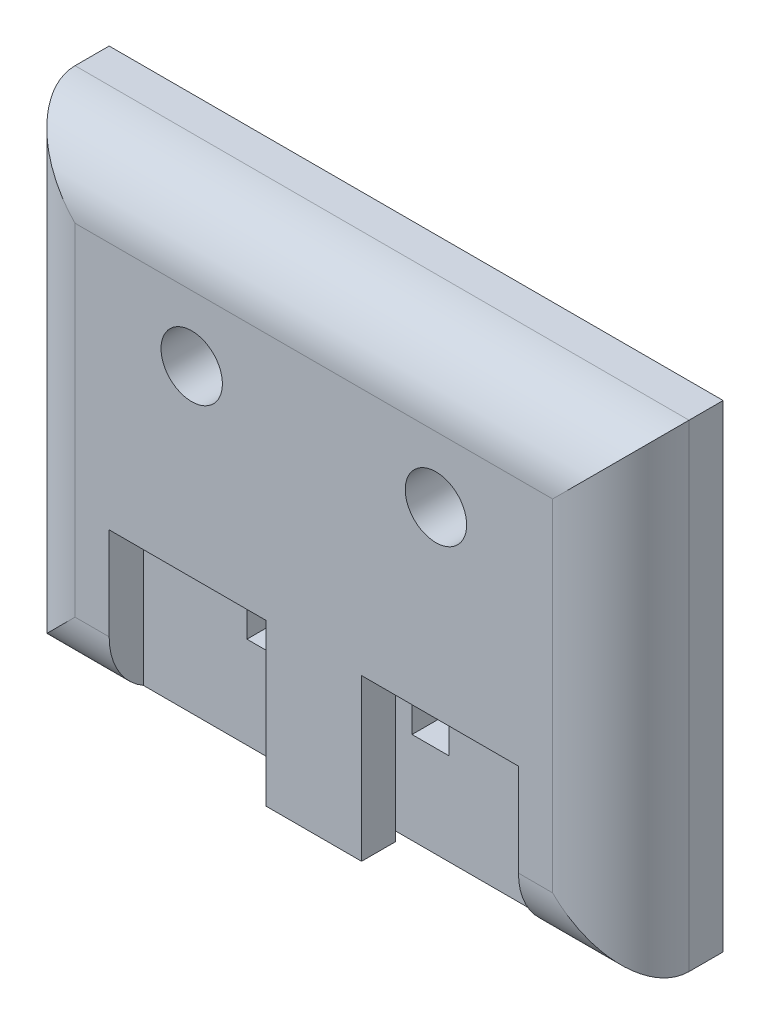
ISO-10303-21;
HEADER;
FILE_DESCRIPTION(('STEP AP214'),'2;1');
FILE_NAME('part.step','',(''),(''),'','','');
FILE_SCHEMA(('AUTOMOTIVE_DESIGN { 1 0 10303 214 1 1 1 1 }'));
ENDSEC;
DATA;
#1=APPLICATION_CONTEXT('core data for automotive mechanical design processes');
#2=APPLICATION_PROTOCOL_DEFINITION('international standard','automotive_design',2000,#1);
#3=PRODUCT_CONTEXT('',#1,'mechanical');
#4=PRODUCT('Part','Part','',(#3));
#5=PRODUCT_RELATED_PRODUCT_CATEGORY('part','',(#4));
#6=PRODUCT_DEFINITION_FORMATION('','',#4);
#7=PRODUCT_DEFINITION_CONTEXT('part definition',#1,'design');
#8=PRODUCT_DEFINITION('design','',#6,#7);
#9=PRODUCT_DEFINITION_SHAPE('','',#8);
#10=(LENGTH_UNIT() NAMED_UNIT(*) SI_UNIT(.MILLI.,.METRE.));
#11=(NAMED_UNIT(*) PLANE_ANGLE_UNIT() SI_UNIT($,.RADIAN.));
#12=(NAMED_UNIT(*) SI_UNIT($,.STERADIAN.) SOLID_ANGLE_UNIT());
#13=UNCERTAINTY_MEASURE_WITH_UNIT(LENGTH_MEASURE(1.E-05),#10,'distance_accuracy_value','');
#14=(GEOMETRIC_REPRESENTATION_CONTEXT(3) GLOBAL_UNCERTAINTY_ASSIGNED_CONTEXT((#13)) GLOBAL_UNIT_ASSIGNED_CONTEXT((#10,
#11,#12)) REPRESENTATION_CONTEXT('',''));
#15=CARTESIAN_POINT('',(0.,0.,0.));
#16=DIRECTION('',(0.,0.,1.));
#17=DIRECTION('',(1.,0.,0.));
#18=AXIS2_PLACEMENT_3D('',#15,#16,#17);
#19=CARTESIAN_POINT('',(0.,0.,9.28222343946548));
#20=DIRECTION('',(0.,0.,-1.));
#21=DIRECTION('',(-1.,0.,0.));
#22=AXIS2_PLACEMENT_3D('',#19,#20,#21);
#23=PLANE('',#22);
#24=DIRECTION('',(0.,-1.,0.));
#25=VECTOR('',#24,1.);
#26=CARTESIAN_POINT('',(59.8,-22.4791044578485,9.28222343946548));
#27=LINE('',#26,#25);
#28=CARTESIAN_POINT('',(59.8,-22.4791044578485,9.28222343946548));
#29=VERTEX_POINT('',#28);
#30=CARTESIAN_POINT('',(59.8,-27.8791044578485,9.28222343946548));
#31=VERTEX_POINT('',#30);
#32=EDGE_CURVE('E248',#29,#31,#27,.T.);
#33=ORIENTED_EDGE('',*,*,#32,.T.);
#34=DIRECTION('',(-1.,0.,0.));
#35=VECTOR('',#34,1.);
#36=CARTESIAN_POINT('',(59.8,-27.8791044578485,9.28222343946548));
#37=LINE('',#36,#35);
#38=CARTESIAN_POINT('',(54.4,-27.8791044578485,9.28222343946548));
#39=VERTEX_POINT('',#38);
#40=EDGE_CURVE('E296',#31,#39,#37,.T.);
#41=ORIENTED_EDGE('',*,*,#40,.T.);
#42=DIRECTION('',(0.,-1.,0.));
#43=VECTOR('',#42,1.);
#44=CARTESIAN_POINT('',(54.4,-22.4791044578485,9.28222343946548));
#45=LINE('',#44,#43);
#46=CARTESIAN_POINT('',(54.4,-22.4791044578485,9.28222343946548));
#47=VERTEX_POINT('',#46);
#48=EDGE_CURVE('E292',#47,#39,#45,.T.);
#49=ORIENTED_EDGE('',*,*,#48,.F.);
#50=DIRECTION('',(-1.,0.,0.));
#51=VECTOR('',#50,1.);
#52=CARTESIAN_POINT('',(59.8,-22.4791044578485,9.28222343946548));
#53=LINE('',#52,#51);
#54=EDGE_CURVE('E288',#29,#47,#53,.T.);
#55=ORIENTED_EDGE('',*,*,#54,.F.);
#56=EDGE_LOOP('',(#33,#41,#49,#55));
#57=FACE_BOUND('',#56,.T.);
#58=DIRECTION('',(0.,1.,0.));
#59=VECTOR('',#58,1.);
#60=CARTESIAN_POINT('',(52.,-42.6791044578483,9.28222343946548));
#61=LINE('',#60,#59);
#62=CARTESIAN_POINT('',(52.,-41.3393584956926,9.28222343946548));
#63=VERTEX_POINT('',#62);
#64=CARTESIAN_POINT('',(52.,-19.096006317054,9.28222343946548));
#65=VERTEX_POINT('',#64);
#66=EDGE_CURVE('E450',#63,#65,#61,.T.);
#67=ORIENTED_EDGE('',*,*,#66,.F.);
#68=DIRECTION('',(1.,0.,0.));
#69=VECTOR('',#68,1.);
#70=CARTESIAN_POINT('',(15.,-41.3393584956926,9.28222343946548));
#71=LINE('',#70,#69);
#72=CARTESIAN_POINT('',(75.,-41.3393584956926,9.28222343946548));
#73=VERTEX_POINT('',#72);
#74=EDGE_CURVE('E400',#63,#73,#71,.T.);
#75=ORIENTED_EDGE('',*,*,#74,.T.);
#76=DIRECTION('',(0.,1.,0.));
#77=VECTOR('',#76,1.);
#78=CARTESIAN_POINT('',(75.,-42.6791044578481,9.28222343946548));
#79=LINE('',#78,#77);
#80=CARTESIAN_POINT('',(75.,-19.096006317054,9.28222343946548));
#81=VERTEX_POINT('',#80);
#82=EDGE_CURVE('E339',#73,#81,#79,.T.);
#83=ORIENTED_EDGE('',*,*,#82,.T.);
#84=DIRECTION('',(1.,0.,0.));
#85=VECTOR('',#84,1.);
#86=CARTESIAN_POINT('',(15.,-19.096006317054,9.28222343946548));
#87=LINE('',#86,#85);
#88=EDGE_CURVE('E334',#65,#81,#87,.T.);
#89=ORIENTED_EDGE('',*,*,#88,.F.);
#90=EDGE_LOOP('',(#67,#75,#83,#89));
#91=FACE_BOUND('',#90,.T.);
#92=ADVANCED_FACE('F47',(#57,#91),#23,.F.);
#93=CARTESIAN_POINT('',(15.,-19.096006317054,9.28222343946548));
#94=DIRECTION('',(0.,-1.,0.));
#95=DIRECTION('',(0.,0.,-1.));
#96=AXIS2_PLACEMENT_3D('',#93,#94,#95);
#97=PLANE('',#96);
#98=DIRECTION('',(1.,0.,0.));
#99=VECTOR('',#98,1.);
#100=CARTESIAN_POINT('',(15.,-19.096006317054,14.2822234394655));
#101=LINE('',#100,#99);
#102=CARTESIAN_POINT('',(52.,-19.096006317054,14.2822234394655));
#103=VERTEX_POINT('',#102);
#104=CARTESIAN_POINT('',(75.,-19.096006317054,14.2822234394655));
#105=VERTEX_POINT('',#104);
#106=EDGE_CURVE('E346',#103,#105,#101,.T.);
#107=ORIENTED_EDGE('',*,*,#106,.F.);
#108=DIRECTION('',(0.,0.,-1.));
#109=VECTOR('',#108,1.);
#110=CARTESIAN_POINT('',(52.,-19.096006317054,14.2822234394655));
#111=LINE('',#110,#109);
#112=EDGE_CURVE('E65',#103,#65,#111,.T.);
#113=ORIENTED_EDGE('',*,*,#112,.T.);
#114=ORIENTED_EDGE('',*,*,#88,.T.);
#115=DIRECTION('',(0.,0.,1.));
#116=VECTOR('',#115,1.);
#117=CARTESIAN_POINT('',(75.,-19.096006317054,9.28222343946548));
#118=LINE('',#117,#116);
#119=EDGE_CURVE('E343',#81,#105,#118,.T.);
#120=ORIENTED_EDGE('',*,*,#119,.T.);
#121=EDGE_LOOP('',(#107,#113,#114,#120));
#122=FACE_BOUND('',#121,.T.);
#123=ADVANCED_FACE('F523',(#122),#97,.T.);
#124=CARTESIAN_POINT('',(90.,-42.6791044578485,-0.717776560534518));
#125=DIRECTION('',(0.,0.,1.));
#126=DIRECTION('',(1.,0.,0.));
#127=AXIS2_PLACEMENT_3D('',#124,#125,#126);
#128=PLANE('',#127);
#129=DIRECTION('',(0.,-1.,0.));
#130=VECTOR('',#129,1.);
#131=CARTESIAN_POINT('',(59.8,-42.6791044578485,-0.717776560534518));
#132=LINE('',#131,#130);
#133=CARTESIAN_POINT('',(59.8,-22.4791044578485,-0.717776560534518));
#134=VERTEX_POINT('',#133);
#135=CARTESIAN_POINT('',(59.8,-27.8791044578485,-0.717776560534518));
#136=VERTEX_POINT('',#135);
#137=EDGE_CURVE('E313',#134,#136,#132,.T.);
#138=ORIENTED_EDGE('',*,*,#137,.F.);
#139=DIRECTION('',(-1.,0.,0.));
#140=VECTOR('',#139,1.);
#141=CARTESIAN_POINT('',(90.,-22.4791044578485,-0.717776560534518));
#142=LINE('',#141,#140);
#143=CARTESIAN_POINT('',(54.4,-22.4791044578485,-0.717776560534518));
#144=VERTEX_POINT('',#143);
#145=EDGE_CURVE('E273',#134,#144,#142,.T.);
#146=ORIENTED_EDGE('',*,*,#145,.T.);
#147=DIRECTION('',(0.,-1.,0.));
#148=VECTOR('',#147,1.);
#149=CARTESIAN_POINT('',(54.4,-42.6791044578485,-0.717776560534518));
#150=LINE('',#149,#148);
#151=CARTESIAN_POINT('',(54.4,-27.8791044578485,-0.717776560534518));
#152=VERTEX_POINT('',#151);
#153=EDGE_CURVE('E306',#144,#152,#150,.T.);
#154=ORIENTED_EDGE('',*,*,#153,.T.);
#155=DIRECTION('',(-1.,0.,0.));
#156=VECTOR('',#155,1.);
#157=CARTESIAN_POINT('',(90.,-27.8791044578485,-0.717776560534518));
#158=LINE('',#157,#156);
#159=EDGE_CURVE('E310',#136,#152,#158,.T.);
#160=ORIENTED_EDGE('',*,*,#159,.F.);
#161=EDGE_LOOP('',(#138,#146,#154,#160));
#162=FACE_BOUND('',#161,.T.);
#163=CARTESIAN_POINT('',(62.9,7.72089554215152,-0.717776560534518));
#164=DIRECTION('',(0.,0.,-1.));
#165=DIRECTION('',(-1.,0.,0.));
#166=AXIS2_PLACEMENT_3D('',#163,#164,#165);
#167=CIRCLE('',#166,2.1);
#168=CARTESIAN_POINT('',(60.8,7.72089554215152,-0.717776560534518));
#169=VERTEX_POINT('',#168);
#170=EDGE_CURVE('E361',#169,#169,#167,.T.);
#171=ORIENTED_EDGE('',*,*,#170,.F.);
#172=EDGE_LOOP('',(#171));
#173=FACE_BOUND('',#172,.T.);
#174=CARTESIAN_POINT('',(27.1,7.72089554215152,-0.717776560534518));
#175=DIRECTION('',(0.,0.,-1.));
#176=DIRECTION('',(1.,0.,0.));
#177=AXIS2_PLACEMENT_3D('',#174,#175,#176);
#178=CIRCLE('',#177,2.1);
#179=CARTESIAN_POINT('',(29.2,7.72089554215152,-0.717776560534518));
#180=VERTEX_POINT('',#179);
#181=EDGE_CURVE('E360',#180,#180,#178,.T.);
#182=ORIENTED_EDGE('',*,*,#181,.F.);
#183=EDGE_LOOP('',(#182));
#184=FACE_BOUND('',#183,.T.);
#185=DIRECTION('',(0.,1.,0.));
#186=VECTOR('',#185,1.);
#187=CARTESIAN_POINT('',(0.,-42.6791044578485,-0.717776560534518));
#188=LINE('',#187,#186);
#189=CARTESIAN_POINT('',(0.,-42.6791044578485,-0.717776560534518));
#190=VERTEX_POINT('',#189);
#191=CARTESIAN_POINT('',(0.,27.3208955421515,-0.717776560534518));
#192=VERTEX_POINT('',#191);
#193=EDGE_CURVE('E374',#190,#192,#188,.T.);
#194=ORIENTED_EDGE('',*,*,#193,.T.);
#195=DIRECTION('',(-1.,0.,0.));
#196=VECTOR('',#195,1.);
#197=CARTESIAN_POINT('',(90.,27.3208955421515,-0.717776560534518));
#198=LINE('',#197,#196);
#199=CARTESIAN_POINT('',(90.,27.3208955421515,-0.717776560534518));
#200=VERTEX_POINT('',#199);
#201=EDGE_CURVE('E381',#200,#192,#198,.T.);
#202=ORIENTED_EDGE('',*,*,#201,.F.);
#203=DIRECTION('',(0.,1.,0.));
#204=VECTOR('',#203,1.);
#205=CARTESIAN_POINT('',(90.,-42.6791044578485,-0.717776560534518));
#206=LINE('',#205,#204);
#207=CARTESIAN_POINT('',(90.,-42.6791044578485,-0.717776560534518));
#208=VERTEX_POINT('',#207);
#209=EDGE_CURVE('E378',#208,#200,#206,.T.);
#210=ORIENTED_EDGE('',*,*,#209,.F.);
#211=DIRECTION('',(-1.,0.,0.));
#212=VECTOR('',#211,1.);
#213=CARTESIAN_POINT('',(90.,-42.6791044578485,-0.717776560534518));
#214=LINE('',#213,#212);
#215=EDGE_CURVE('E390',#208,#190,#214,.T.);
#216=ORIENTED_EDGE('',*,*,#215,.T.);
#217=EDGE_LOOP('',(#194,#202,#210,#216));
#218=FACE_BOUND('',#217,.T.);
#219=DIRECTION('',(0.,1.,0.));
#220=VECTOR('',#219,1.);
#221=CARTESIAN_POINT('',(30.2000000000001,-42.6791044578485,-0.717776560534518));
#222=LINE('',#221,#220);
#223=CARTESIAN_POINT('',(30.2000000000001,-27.8791044578485,-0.717776560534518));
#224=VERTEX_POINT('',#223);
#225=CARTESIAN_POINT('',(30.2000000000001,-22.4791044578485,-0.717776560534518));
#226=VERTEX_POINT('',#225);
#227=EDGE_CURVE('E327',#224,#226,#222,.T.);
#228=ORIENTED_EDGE('',*,*,#227,.F.);
#229=DIRECTION('',(1.,0.,0.));
#230=VECTOR('',#229,1.);
#231=CARTESIAN_POINT('',(90.,-27.8791044578485,-0.717776560534518));
#232=LINE('',#231,#230);
#233=CARTESIAN_POINT('',(35.6000000000001,-27.8791044578485,-0.717776560534518));
#234=VERTEX_POINT('',#233);
#235=EDGE_CURVE('E316',#224,#234,#232,.T.);
#236=ORIENTED_EDGE('',*,*,#235,.T.);
#237=DIRECTION('',(0.,1.,0.));
#238=VECTOR('',#237,1.);
#239=CARTESIAN_POINT('',(35.6000000000001,-42.6791044578485,-0.717776560534518));
#240=LINE('',#239,#238);
#241=CARTESIAN_POINT('',(35.6000000000001,-22.4791044578485,-0.717776560534518));
#242=VERTEX_POINT('',#241);
#243=EDGE_CURVE('E320',#234,#242,#240,.T.);
#244=ORIENTED_EDGE('',*,*,#243,.T.);
#245=DIRECTION('',(1.,0.,0.));
#246=VECTOR('',#245,1.);
#247=CARTESIAN_POINT('',(90.,-22.4791044578485,-0.717776560534518));
#248=LINE('',#247,#246);
#249=EDGE_CURVE('E324',#226,#242,#248,.T.);
#250=ORIENTED_EDGE('',*,*,#249,.F.);
#251=EDGE_LOOP('',(#228,#236,#244,#250));
#252=FACE_BOUND('',#251,.T.);
#253=ADVANCED_FACE('F494',(#162,#173,#184,#218,#252),#128,.F.);
#254=CARTESIAN_POINT('',(15.,-41.3393584956926,9.28222343946548));
#255=VERTEX_POINT('',#254);
#256=CARTESIAN_POINT('',(38.,-41.3393584956926,9.28222343946548));
#257=VERTEX_POINT('',#256);
#258=EDGE_CURVE('E401',#255,#257,#71,.T.);
#259=ORIENTED_EDGE('',*,*,#258,.T.);
#260=DIRECTION('',(0.,1.,0.));
#261=VECTOR('',#260,1.);
#262=CARTESIAN_POINT('',(38.,-42.6791044578483,9.28222343946548));
#263=LINE('',#262,#261);
#264=CARTESIAN_POINT('',(38.,-19.096006317054,9.28222343946548));
#265=VERTEX_POINT('',#264);
#266=EDGE_CURVE('E73',#257,#265,#263,.T.);
#267=ORIENTED_EDGE('',*,*,#266,.T.);
#268=CARTESIAN_POINT('',(15.,-19.096006317054,9.28222343946548));
#269=VERTEX_POINT('',#268);
#270=EDGE_CURVE('E336',#269,#265,#87,.T.);
#271=ORIENTED_EDGE('',*,*,#270,.F.);
#272=DIRECTION('',(0.,1.,0.));
#273=VECTOR('',#272,1.);
#274=CARTESIAN_POINT('',(15.,-42.6791044578481,9.28222343946548));
#275=LINE('',#274,#273);
#276=EDGE_CURVE('E331',#255,#269,#275,.T.);
#277=ORIENTED_EDGE('',*,*,#276,.F.);
#278=EDGE_LOOP('',(#259,#267,#271,#277));
#279=FACE_BOUND('',#278,.T.);
#280=DIRECTION('',(0.,1.,0.));
#281=VECTOR('',#280,1.);
#282=CARTESIAN_POINT('',(30.2000000000001,-27.8791044578485,9.28222343946548));
#283=LINE('',#282,#281);
#284=CARTESIAN_POINT('',(30.2000000000001,-27.8791044578485,9.28222343946548));
#285=VERTEX_POINT('',#284);
#286=CARTESIAN_POINT('',(30.2000000000001,-22.4791044578485,9.28222343946548));
#287=VERTEX_POINT('',#286);
#288=EDGE_CURVE('E243',#285,#287,#283,.T.);
#289=ORIENTED_EDGE('',*,*,#288,.T.);
#290=DIRECTION('',(1.,0.,0.));
#291=VECTOR('',#290,1.);
#292=CARTESIAN_POINT('',(30.2000000000001,-22.4791044578485,9.28222343946548));
#293=LINE('',#292,#291);
#294=CARTESIAN_POINT('',(35.6000000000001,-22.4791044578485,9.28222343946548));
#295=VERTEX_POINT('',#294);
#296=EDGE_CURVE('E247',#287,#295,#293,.T.);
#297=ORIENTED_EDGE('',*,*,#296,.T.);
#298=DIRECTION('',(0.,1.,0.));
#299=VECTOR('',#298,1.);
#300=CARTESIAN_POINT('',(35.6000000000001,-27.8791044578485,9.28222343946548));
#301=LINE('',#300,#299);
#302=CARTESIAN_POINT('',(35.6000000000001,-27.8791044578485,9.28222343946548));
#303=VERTEX_POINT('',#302);
#304=EDGE_CURVE('E252',#303,#295,#301,.T.);
#305=ORIENTED_EDGE('',*,*,#304,.F.);
#306=DIRECTION('',(1.,0.,0.));
#307=VECTOR('',#306,1.);
#308=CARTESIAN_POINT('',(30.2000000000001,-27.8791044578485,9.28222343946548));
#309=LINE('',#308,#307);
#310=EDGE_CURVE('E256',#285,#303,#309,.T.);
#311=ORIENTED_EDGE('',*,*,#310,.F.);
#312=EDGE_LOOP('',(#289,#297,#305,#311));
#313=FACE_BOUND('',#312,.T.);
#314=ADVANCED_FACE('F491',(#279,#313),#23,.F.);
#315=CARTESIAN_POINT('',(90.,-12.6791044578485,14.2822234394655));
#316=DIRECTION('',(0.,0.,1.));
#317=DIRECTION('',(1.,0.,0.));
#318=AXIS2_PLACEMENT_3D('',#315,#316,#317);
#319=PLANE('',#318);
#320=CARTESIAN_POINT('',(27.1,7.72089554215152,14.2822234394655));
#321=DIRECTION('',(0.,0.,1.));
#322=DIRECTION('',(1.,0.,0.));
#323=AXIS2_PLACEMENT_3D('',#320,#321,#322);
#324=CIRCLE('',#323,4.5);
#325=CARTESIAN_POINT('',(31.6,7.72089554215152,14.2822234394655));
#326=VERTEX_POINT('',#325);
#327=EDGE_CURVE('E692',#326,#326,#324,.T.);
#328=ORIENTED_EDGE('',*,*,#327,.F.);
#329=EDGE_LOOP('',(#328));
#330=FACE_BOUND('',#329,.T.);
#331=CARTESIAN_POINT('',(62.9,7.72089554215152,14.2822234394655));
#332=DIRECTION('',(0.,0.,1.));
#333=DIRECTION('',(1.,0.,0.));
#334=AXIS2_PLACEMENT_3D('',#331,#332,#333);
#335=CIRCLE('',#334,4.5);
#336=CARTESIAN_POINT('',(67.4,7.72089554215152,14.2822234394655));
#337=VERTEX_POINT('',#336);
#338=EDGE_CURVE('E445',#337,#337,#335,.T.);
#339=ORIENTED_EDGE('',*,*,#338,.F.);
#340=EDGE_LOOP('',(#339));
#341=FACE_BOUND('',#340,.T.);
#342=DIRECTION('',(0.,1.,0.));
#343=VECTOR('',#342,1.);
#344=CARTESIAN_POINT('',(75.,-42.6791044578481,14.2822234394655));
#345=LINE('',#344,#343);
#346=CARTESIAN_POINT('',(75.,-32.6791044578482,14.2822234394655));
#347=VERTEX_POINT('',#346);
#348=EDGE_CURVE('E335',#347,#105,#345,.T.);
#349=ORIENTED_EDGE('',*,*,#348,.F.);
#350=DIRECTION('',(-1.,0.,0.));
#351=VECTOR('',#350,1.);
#352=CARTESIAN_POINT('',(90.,-32.6791044578482,14.2822234394655));
#353=LINE('',#352,#351);
#354=CARTESIAN_POINT('',(80.,-32.6791044578482,14.2822234394655));
#355=VERTEX_POINT('',#354);
#356=EDGE_CURVE('E420',#347,#355,#353,.F.);
#357=ORIENTED_EDGE('',*,*,#356,.T.);
#358=DIRECTION('',(0.,1.,0.));
#359=VECTOR('',#358,1.);
#360=CARTESIAN_POINT('',(80.,27.3208955421515,14.2822234394655));
#361=LINE('',#360,#359);
#362=CARTESIAN_POINT('',(80.,17.3208955421515,14.2822234394655));
#363=VERTEX_POINT('',#362);
#364=EDGE_CURVE('E417',#355,#363,#361,.T.);
#365=ORIENTED_EDGE('',*,*,#364,.T.);
#366=DIRECTION('',(-1.,0.,0.));
#367=VECTOR('',#366,1.);
#368=CARTESIAN_POINT('',(0.,17.3208955421515,14.2822234394655));
#369=LINE('',#368,#367);
#370=CARTESIAN_POINT('',(10.,17.3208955421515,14.2822234394655));
#371=VERTEX_POINT('',#370);
#372=EDGE_CURVE('E414',#363,#371,#369,.T.);
#373=ORIENTED_EDGE('',*,*,#372,.T.);
#374=DIRECTION('',(0.,1.,0.));
#375=VECTOR('',#374,1.);
#376=CARTESIAN_POINT('',(9.99999999999999,-12.6791044578485,14.2822234394655));
#377=LINE('',#376,#375);
#378=CARTESIAN_POINT('',(10.,-32.6791044578482,14.2822234394655));
#379=VERTEX_POINT('',#378);
#380=EDGE_CURVE('E411',#371,#379,#377,.F.);
#381=ORIENTED_EDGE('',*,*,#380,.T.);
#382=DIRECTION('',(-1.,0.,0.));
#383=VECTOR('',#382,1.);
#384=CARTESIAN_POINT('',(15.,-32.6791044578482,14.2822234394655));
#385=LINE('',#384,#383);
#386=CARTESIAN_POINT('',(15.,-32.6791044578482,14.2822234394655));
#387=VERTEX_POINT('',#386);
#388=EDGE_CURVE('E408',#379,#387,#385,.F.);
#389=ORIENTED_EDGE('',*,*,#388,.T.);
#390=DIRECTION('',(0.,1.,0.));
#391=VECTOR('',#390,1.);
#392=CARTESIAN_POINT('',(15.,-42.6791044578481,14.2822234394655));
#393=LINE('',#392,#391);
#394=CARTESIAN_POINT('',(15.,-19.096006317054,14.2822234394655));
#395=VERTEX_POINT('',#394);
#396=EDGE_CURVE('E330',#387,#395,#393,.T.);
#397=ORIENTED_EDGE('',*,*,#396,.T.);
#398=CARTESIAN_POINT('',(38.,-19.096006317054,14.2822234394655));
#399=VERTEX_POINT('',#398);
#400=EDGE_CURVE('E347',#395,#399,#101,.T.);
#401=ORIENTED_EDGE('',*,*,#400,.T.);
#402=DIRECTION('',(0.,1.,0.));
#403=VECTOR('',#402,1.);
#404=CARTESIAN_POINT('',(38.,-42.6791044578483,14.2822234394655));
#405=LINE('',#404,#403);
#406=CARTESIAN_POINT('',(38.,-42.6791044578483,14.2822234394655));
#407=VERTEX_POINT('',#406);
#408=EDGE_CURVE('E216',#407,#399,#405,.T.);
#409=ORIENTED_EDGE('',*,*,#408,.F.);
#410=DIRECTION('',(1.,0.,0.));
#411=VECTOR('',#410,1.);
#412=CARTESIAN_POINT('',(38.,-42.6791044578483,14.2822234394655));
#413=LINE('',#412,#411);
#414=CARTESIAN_POINT('',(52.,-42.6791044578483,14.2822234394655));
#415=VERTEX_POINT('',#414);
#416=EDGE_CURVE('E217',#407,#415,#413,.T.);
#417=ORIENTED_EDGE('',*,*,#416,.T.);
#418=DIRECTION('',(0.,1.,0.));
#419=VECTOR('',#418,1.);
#420=CARTESIAN_POINT('',(52.,-42.6791044578483,14.2822234394655));
#421=LINE('',#420,#419);
#422=EDGE_CURVE('E206',#415,#103,#421,.T.);
#423=ORIENTED_EDGE('',*,*,#422,.T.);
#424=ORIENTED_EDGE('',*,*,#106,.T.);
#425=EDGE_LOOP('',(#349,#357,#365,#373,#381,#389,#397,#401,#409,#417,#423,#424));
#426=FACE_BOUND('',#425,.T.);
#427=ADVANCED_FACE('F222',(#330,#341,#426),#319,.T.);
#428=CARTESIAN_POINT('',(90.,-42.6791044578485,14.2822234394655));
#429=DIRECTION('',(0.,1.,0.));
#430=DIRECTION('',(0.,0.,1.));
#431=AXIS2_PLACEMENT_3D('',#428,#429,#430);
#432=PLANE('',#431);
#433=DIRECTION('',(0.,1.17898749625013E-13,1.));
#434=VECTOR('',#433,1.);
#435=CARTESIAN_POINT('',(90.,-42.6791044578485,-0.717776560534518));
#436=LINE('',#435,#434);
#437=CARTESIAN_POINT('',(90.,-42.6791044578479,4.28222343946548));
#438=VERTEX_POINT('',#437);
#439=EDGE_CURVE('E369',#208,#438,#436,.T.);
#440=ORIENTED_EDGE('',*,*,#439,.T.);
#441=DIRECTION('',(-1.,0.,0.));
#442=VECTOR('',#441,1.);
#443=CARTESIAN_POINT('',(0.,-42.6791044578482,4.28222343946518));
#444=LINE('',#443,#442);
#445=CARTESIAN_POINT('',(0.,-42.6791044578482,4.28222343946519));
#446=VERTEX_POINT('',#445);
#447=EDGE_CURVE('E394',#438,#446,#444,.T.);
#448=ORIENTED_EDGE('',*,*,#447,.T.);
#449=DIRECTION('',(0.,0.,-1.));
#450=VECTOR('',#449,1.);
#451=CARTESIAN_POINT('',(0.,-42.6791044578485,14.2822234394655));
#452=LINE('',#451,#450);
#453=EDGE_CURVE('E365',#446,#190,#452,.T.);
#454=ORIENTED_EDGE('',*,*,#453,.T.);
#455=ORIENTED_EDGE('',*,*,#215,.F.);
#456=EDGE_LOOP('',(#440,#448,#454,#455));
#457=FACE_BOUND('',#456,.T.);
#458=ADVANCED_FACE('F564',(#457),#432,.F.);
#459=CARTESIAN_POINT('',(90.,27.3208955421515,-0.717776560534518));
#460=DIRECTION('',(0.,-1.,0.));
#461=DIRECTION('',(0.,0.,-1.));
#462=AXIS2_PLACEMENT_3D('',#459,#460,#461);
#463=PLANE('',#462);
#464=DIRECTION('',(0.,0.,1.));
#465=VECTOR('',#464,1.);
#466=CARTESIAN_POINT('',(0.,27.3208955421515,-0.717776560534518));
#467=LINE('',#466,#465);
#468=CARTESIAN_POINT('',(0.,27.3208955421515,4.28222343946548));
#469=VERTEX_POINT('',#468);
#470=EDGE_CURVE('E384',#192,#469,#467,.T.);
#471=ORIENTED_EDGE('',*,*,#470,.T.);
#472=DIRECTION('',(-1.,0.,0.));
#473=VECTOR('',#472,1.);
#474=CARTESIAN_POINT('',(90.,27.3208955421515,4.28222343946548));
#475=LINE('',#474,#473);
#476=CARTESIAN_POINT('',(90.,27.3208955421515,4.28222343946548));
#477=VERTEX_POINT('',#476);
#478=EDGE_CURVE('E428',#469,#477,#475,.F.);
#479=ORIENTED_EDGE('',*,*,#478,.T.);
#480=DIRECTION('',(0.,0.,1.));
#481=VECTOR('',#480,1.);
#482=CARTESIAN_POINT('',(90.,27.3208955421515,-0.717776560534518));
#483=LINE('',#482,#481);
#484=EDGE_CURVE('E373',#200,#477,#483,.T.);
#485=ORIENTED_EDGE('',*,*,#484,.F.);
#486=ORIENTED_EDGE('',*,*,#201,.T.);
#487=EDGE_LOOP('',(#471,#479,#485,#486));
#488=FACE_BOUND('',#487,.T.);
#489=ADVANCED_FACE('F554',(#488),#463,.F.);
#490=CARTESIAN_POINT('',(90.,0.,0.));
#491=DIRECTION('',(-1.,0.,0.));
#492=DIRECTION('',(0.,0.,1.));
#493=AXIS2_PLACEMENT_3D('',#490,#491,#492);
#494=PLANE('',#493);
#495=ORIENTED_EDGE('',*,*,#484,.T.);
#496=DIRECTION('',(0.,1.,0.));
#497=VECTOR('',#496,1.);
#498=CARTESIAN_POINT('',(90.,-42.6791044578485,4.28222343946548));
#499=LINE('',#498,#497);
#500=EDGE_CURVE('E424',#477,#438,#499,.F.);
#501=ORIENTED_EDGE('',*,*,#500,.T.);
#502=ORIENTED_EDGE('',*,*,#439,.F.);
#503=ORIENTED_EDGE('',*,*,#209,.T.);
#504=EDGE_LOOP('',(#495,#501,#502,#503));
#505=FACE_BOUND('',#504,.T.);
#506=ADVANCED_FACE('F551',(#505),#494,.F.);
#507=CARTESIAN_POINT('',(0.,0.,0.));
#508=DIRECTION('',(-1.,0.,0.));
#509=DIRECTION('',(0.,0.,1.));
#510=AXIS2_PLACEMENT_3D('',#507,#508,#509);
#511=PLANE('',#510);
#512=ORIENTED_EDGE('',*,*,#453,.F.);
#513=DIRECTION('',(0.,1.,0.));
#514=VECTOR('',#513,1.);
#515=CARTESIAN_POINT('',(0.,0.,4.28222343946548));
#516=LINE('',#515,#514);
#517=EDGE_CURVE('E57',#446,#469,#516,.T.);
#518=ORIENTED_EDGE('',*,*,#517,.T.);
#519=ORIENTED_EDGE('',*,*,#470,.F.);
#520=ORIENTED_EDGE('',*,*,#193,.F.);
#521=EDGE_LOOP('',(#512,#518,#519,#520));
#522=FACE_BOUND('',#521,.T.);
#523=ADVANCED_FACE('F549',(#522),#511,.T.);
#524=CARTESIAN_POINT('',(27.1,7.72089554215152,14.2822234394655));
#525=DIRECTION('',(0.,0.,-1.));
#526=DIRECTION('',(-1.,0.,0.));
#527=AXIS2_PLACEMENT_3D('',#524,#525,#526);
#528=CYLINDRICAL_SURFACE('',#527,2.1);
#529=CARTESIAN_POINT('',(27.1,7.72089554215152,3.78222343946548));
#530=DIRECTION('',(0.,0.,-1.));
#531=DIRECTION('',(-1.,0.,0.));
#532=AXIS2_PLACEMENT_3D('',#529,#530,#531);
#533=CIRCLE('',#532,2.1);
#534=CARTESIAN_POINT('',(25.,7.72089554215152,3.78222343946548));
#535=VERTEX_POINT('',#534);
#536=EDGE_CURVE('E51',#535,#535,#533,.F.);
#537=ORIENTED_EDGE('',*,*,#536,.T.);
#538=EDGE_LOOP('',(#537));
#539=FACE_BOUND('',#538,.T.);
#540=ORIENTED_EDGE('',*,*,#181,.T.);
#541=EDGE_LOOP('',(#540));
#542=FACE_BOUND('',#541,.T.);
#543=ADVANCED_FACE('F546',(#539,#542),#528,.F.);
#544=CARTESIAN_POINT('',(62.9,7.72089554215152,14.2822234394655));
#545=DIRECTION('',(0.,0.,-1.));
#546=DIRECTION('',(-1.,0.,0.));
#547=AXIS2_PLACEMENT_3D('',#544,#545,#546);
#548=CYLINDRICAL_SURFACE('',#547,2.1);
#549=CARTESIAN_POINT('',(62.9,7.72089554215152,3.78222343946548));
#550=DIRECTION('',(0.,0.,-1.));
#551=DIRECTION('',(-1.,0.,0.));
#552=AXIS2_PLACEMENT_3D('',#549,#550,#551);
#553=CIRCLE('',#552,2.1);
#554=CARTESIAN_POINT('',(60.8,7.72089554215152,3.78222343946548));
#555=VERTEX_POINT('',#554);
#556=EDGE_CURVE('E442',#555,#555,#553,.F.);
#557=ORIENTED_EDGE('',*,*,#556,.T.);
#558=EDGE_LOOP('',(#557));
#559=FACE_BOUND('',#558,.T.);
#560=ORIENTED_EDGE('',*,*,#170,.T.);
#561=EDGE_LOOP('',(#560));
#562=FACE_BOUND('',#561,.T.);
#563=ADVANCED_FACE('F543',(#559,#562),#548,.F.);
#564=CARTESIAN_POINT('',(15.,-42.6791044578481,9.28222343946548));
#565=DIRECTION('',(1.,0.,0.));
#566=DIRECTION('',(0.,0.,-1.));
#567=AXIS2_PLACEMENT_3D('',#564,#565,#566);
#568=PLANE('',#567);
#569=ORIENTED_EDGE('',*,*,#396,.F.);
#570=CARTESIAN_POINT('',(15.,-32.6791044578482,4.28222343946548));
#571=DIRECTION('',(1.,0.,0.));
#572=DIRECTION('',(0.,0.,-1.));
#573=AXIS2_PLACEMENT_3D('',#570,#571,#572);
#574=CIRCLE('',#573,10.);
#575=EDGE_CURVE('E11',#387,#255,#574,.T.);
#576=ORIENTED_EDGE('',*,*,#575,.T.);
#577=ORIENTED_EDGE('',*,*,#276,.T.);
#578=DIRECTION('',(0.,0.,1.));
#579=VECTOR('',#578,1.);
#580=CARTESIAN_POINT('',(15.,-19.096006317054,9.28222343946548));
#581=LINE('',#580,#579);
#582=EDGE_CURVE('E356',#269,#395,#581,.T.);
#583=ORIENTED_EDGE('',*,*,#582,.T.);
#584=EDGE_LOOP('',(#569,#576,#577,#583));
#585=FACE_BOUND('',#584,.T.);
#586=ADVANCED_FACE('F485',(#585),#568,.T.);
#587=DIRECTION('',(0.,0.,-1.));
#588=VECTOR('',#587,1.);
#589=CARTESIAN_POINT('',(38.,-19.096006317054,14.2822234394655));
#590=LINE('',#589,#588);
#591=EDGE_CURVE('E239',#399,#265,#590,.T.);
#592=ORIENTED_EDGE('',*,*,#591,.F.);
#593=ORIENTED_EDGE('',*,*,#400,.F.);
#594=ORIENTED_EDGE('',*,*,#582,.F.);
#595=ORIENTED_EDGE('',*,*,#270,.T.);
#596=EDGE_LOOP('',(#592,#593,#594,#595));
#597=FACE_BOUND('',#596,.T.);
#598=ADVANCED_FACE('F479',(#597),#97,.T.);
#599=CARTESIAN_POINT('',(75.,-42.6791044578481,9.28222343946548));
#600=DIRECTION('',(1.,0.,0.));
#601=DIRECTION('',(0.,0.,-1.));
#602=AXIS2_PLACEMENT_3D('',#599,#600,#601);
#603=PLANE('',#602);
#604=ORIENTED_EDGE('',*,*,#82,.F.);
#605=CARTESIAN_POINT('',(75.,-32.6791044578482,4.28222343946548));
#606=DIRECTION('',(1.,0.,0.));
#607=DIRECTION('',(0.,0.,-1.));
#608=AXIS2_PLACEMENT_3D('',#605,#606,#607);
#609=CIRCLE('',#608,10.);
#610=EDGE_CURVE('E404',#73,#347,#609,.F.);
#611=ORIENTED_EDGE('',*,*,#610,.T.);
#612=ORIENTED_EDGE('',*,*,#348,.T.);
#613=ORIENTED_EDGE('',*,*,#119,.F.);
#614=EDGE_LOOP('',(#604,#611,#612,#613));
#615=FACE_BOUND('',#614,.T.);
#616=ADVANCED_FACE('F535',(#615),#603,.F.);
#617=CARTESIAN_POINT('',(59.8,-22.4791044578485,-0.917776560534519));
#618=DIRECTION('',(-1.,0.,0.));
#619=DIRECTION('',(0.,0.,1.));
#620=AXIS2_PLACEMENT_3D('',#617,#618,#619);
#621=PLANE('',#620);
#622=ORIENTED_EDGE('',*,*,#137,.T.);
#623=DIRECTION('',(0.,0.,1.));
#624=VECTOR('',#623,1.);
#625=CARTESIAN_POINT('',(59.8,-27.8791044578485,-0.917776560534519));
#626=LINE('',#625,#624);
#627=EDGE_CURVE('E274',#136,#31,#626,.T.);
#628=ORIENTED_EDGE('',*,*,#627,.T.);
#629=ORIENTED_EDGE('',*,*,#32,.F.);
#630=DIRECTION('',(0.,0.,1.));
#631=VECTOR('',#630,1.);
#632=CARTESIAN_POINT('',(59.8,-22.4791044578485,-0.917776560534519));
#633=LINE('',#632,#631);
#634=EDGE_CURVE('E284',#134,#29,#633,.T.);
#635=ORIENTED_EDGE('',*,*,#634,.F.);
#636=EDGE_LOOP('',(#622,#628,#629,#635));
#637=FACE_BOUND('',#636,.T.);
#638=ADVANCED_FACE('F537',(#637),#621,.T.);
#639=CARTESIAN_POINT('',(59.8,-27.8791044578485,-0.917776560534519));
#640=DIRECTION('',(0.,1.,0.));
#641=DIRECTION('',(0.,0.,1.));
#642=AXIS2_PLACEMENT_3D('',#639,#640,#641);
#643=PLANE('',#642);
#644=ORIENTED_EDGE('',*,*,#159,.T.);
#645=DIRECTION('',(0.,0.,1.));
#646=VECTOR('',#645,1.);
#647=CARTESIAN_POINT('',(54.4,-27.8791044578485,-0.917776560534519));
#648=LINE('',#647,#646);
#649=EDGE_CURVE('E277',#152,#39,#648,.T.);
#650=ORIENTED_EDGE('',*,*,#649,.T.);
#651=ORIENTED_EDGE('',*,*,#40,.F.);
#652=ORIENTED_EDGE('',*,*,#627,.F.);
#653=EDGE_LOOP('',(#644,#650,#651,#652));
#654=FACE_BOUND('',#653,.T.);
#655=ADVANCED_FACE('F795',(#654),#643,.T.);
#656=CARTESIAN_POINT('',(54.4,-22.4791044578485,-0.917776560534519));
#657=DIRECTION('',(-1.,0.,0.));
#658=DIRECTION('',(0.,0.,1.));
#659=AXIS2_PLACEMENT_3D('',#656,#657,#658);
#660=PLANE('',#659);
#661=DIRECTION('',(0.,0.,1.));
#662=VECTOR('',#661,1.);
#663=CARTESIAN_POINT('',(54.4,-22.4791044578485,-0.917776560534519));
#664=LINE('',#663,#662);
#665=EDGE_CURVE('E281',#144,#47,#664,.T.);
#666=ORIENTED_EDGE('',*,*,#665,.T.);
#667=ORIENTED_EDGE('',*,*,#48,.T.);
#668=ORIENTED_EDGE('',*,*,#649,.F.);
#669=ORIENTED_EDGE('',*,*,#153,.F.);
#670=EDGE_LOOP('',(#666,#667,#668,#669));
#671=FACE_BOUND('',#670,.T.);
#672=ADVANCED_FACE('F786',(#671),#660,.F.);
#673=CARTESIAN_POINT('',(59.8,-22.4791044578485,-0.917776560534519));
#674=DIRECTION('',(0.,1.,0.));
#675=DIRECTION('',(0.,0.,1.));
#676=AXIS2_PLACEMENT_3D('',#673,#674,#675);
#677=PLANE('',#676);
#678=ORIENTED_EDGE('',*,*,#634,.T.);
#679=ORIENTED_EDGE('',*,*,#54,.T.);
#680=ORIENTED_EDGE('',*,*,#665,.F.);
#681=ORIENTED_EDGE('',*,*,#145,.F.);
#682=EDGE_LOOP('',(#678,#679,#680,#681));
#683=FACE_BOUND('',#682,.T.);
#684=ADVANCED_FACE('F533',(#683),#677,.F.);
#685=CARTESIAN_POINT('',(30.2000000000001,-27.8791044578485,-0.917776560534519));
#686=DIRECTION('',(1.,0.,0.));
#687=DIRECTION('',(0.,0.,-1.));
#688=AXIS2_PLACEMENT_3D('',#685,#686,#687);
#689=PLANE('',#688);
#690=ORIENTED_EDGE('',*,*,#227,.T.);
#691=DIRECTION('',(0.,0.,1.));
#692=VECTOR('',#691,1.);
#693=CARTESIAN_POINT('',(30.2000000000001,-22.4791044578485,-0.917776560534519));
#694=LINE('',#693,#692);
#695=EDGE_CURVE('E270',#226,#287,#694,.T.);
#696=ORIENTED_EDGE('',*,*,#695,.T.);
#697=ORIENTED_EDGE('',*,*,#288,.F.);
#698=DIRECTION('',(0.,0.,1.));
#699=VECTOR('',#698,1.);
#700=CARTESIAN_POINT('',(30.2000000000001,-27.8791044578485,-0.917776560534519));
#701=LINE('',#700,#699);
#702=EDGE_CURVE('E260',#224,#285,#701,.T.);
#703=ORIENTED_EDGE('',*,*,#702,.F.);
#704=EDGE_LOOP('',(#690,#696,#697,#703));
#705=FACE_BOUND('',#704,.T.);
#706=ADVANCED_FACE('F501',(#705),#689,.T.);
#707=CARTESIAN_POINT('',(30.2000000000001,-22.4791044578485,-0.917776560534519));
#708=DIRECTION('',(0.,-1.,0.));
#709=DIRECTION('',(0.,0.,-1.));
#710=AXIS2_PLACEMENT_3D('',#707,#708,#709);
#711=PLANE('',#710);
#712=ORIENTED_EDGE('',*,*,#249,.T.);
#713=DIRECTION('',(0.,0.,1.));
#714=VECTOR('',#713,1.);
#715=CARTESIAN_POINT('',(35.6000000000001,-22.4791044578485,-0.917776560534519));
#716=LINE('',#715,#714);
#717=EDGE_CURVE('E267',#242,#295,#716,.T.);
#718=ORIENTED_EDGE('',*,*,#717,.T.);
#719=ORIENTED_EDGE('',*,*,#296,.F.);
#720=ORIENTED_EDGE('',*,*,#695,.F.);
#721=EDGE_LOOP('',(#712,#718,#719,#720));
#722=FACE_BOUND('',#721,.T.);
#723=ADVANCED_FACE('F510',(#722),#711,.T.);
#724=CARTESIAN_POINT('',(35.6000000000001,-27.8791044578485,-0.917776560534519));
#725=DIRECTION('',(1.,0.,0.));
#726=DIRECTION('',(0.,0.,-1.));
#727=AXIS2_PLACEMENT_3D('',#724,#725,#726);
#728=PLANE('',#727);
#729=DIRECTION('',(0.,0.,1.));
#730=VECTOR('',#729,1.);
#731=CARTESIAN_POINT('',(35.6000000000001,-27.8791044578485,-0.917776560534519));
#732=LINE('',#731,#730);
#733=EDGE_CURVE('E264',#234,#303,#732,.T.);
#734=ORIENTED_EDGE('',*,*,#733,.T.);
#735=ORIENTED_EDGE('',*,*,#304,.T.);
#736=ORIENTED_EDGE('',*,*,#717,.F.);
#737=ORIENTED_EDGE('',*,*,#243,.F.);
#738=EDGE_LOOP('',(#734,#735,#736,#737));
#739=FACE_BOUND('',#738,.T.);
#740=ADVANCED_FACE('F513',(#739),#728,.F.);
#741=CARTESIAN_POINT('',(30.2000000000001,-27.8791044578485,-0.917776560534519));
#742=DIRECTION('',(0.,-1.,0.));
#743=DIRECTION('',(0.,0.,-1.));
#744=AXIS2_PLACEMENT_3D('',#741,#742,#743);
#745=PLANE('',#744);
#746=ORIENTED_EDGE('',*,*,#702,.T.);
#747=ORIENTED_EDGE('',*,*,#310,.T.);
#748=ORIENTED_EDGE('',*,*,#733,.F.);
#749=ORIENTED_EDGE('',*,*,#235,.F.);
#750=EDGE_LOOP('',(#746,#747,#748,#749));
#751=FACE_BOUND('',#750,.T.);
#752=ADVANCED_FACE('F505',(#751),#745,.F.);
#753=CARTESIAN_POINT('',(90.,17.3208955421515,4.28222343946548));
#754=DIRECTION('',(1.,0.,0.));
#755=DIRECTION('',(0.,0.,-1.));
#756=AXIS2_PLACEMENT_3D('',#753,#754,#755);
#757=CYLINDRICAL_SURFACE('',#756,10.);
#758=CARTESIAN_POINT('',(80.,17.3208955421515,4.28222343946548));
#759=DIRECTION('',(0.707106781186547,-0.707106781186547,0.));
#760=DIRECTION('',(0.707106781186547,0.707106781186547,0.));
#761=AXIS2_PLACEMENT_3D('',#758,#759,#760);
#762=ELLIPSE('',#761,14.1421356237309,10.);
#763=EDGE_CURVE('E436',#477,#363,#762,.T.);
#764=ORIENTED_EDGE('',*,*,#763,.F.);
#765=ORIENTED_EDGE('',*,*,#478,.F.);
#766=CARTESIAN_POINT('',(10.,17.3208955421515,4.28222343946548));
#767=DIRECTION('',(0.707106781186547,0.707106781186547,0.));
#768=DIRECTION('',(-0.707106781186547,0.707106781186547,0.));
#769=AXIS2_PLACEMENT_3D('',#766,#767,#768);
#770=ELLIPSE('',#769,14.1421356237309,10.);
#771=EDGE_CURVE('E278',#371,#469,#770,.F.);
#772=ORIENTED_EDGE('',*,*,#771,.F.);
#773=ORIENTED_EDGE('',*,*,#372,.F.);
#774=EDGE_LOOP('',(#764,#765,#772,#773));
#775=FACE_BOUND('',#774,.T.);
#776=ADVANCED_FACE('F49',(#775),#757,.T.);
#777=CARTESIAN_POINT('',(10.,0.,4.28222343946548));
#778=DIRECTION('',(0.,1.,0.));
#779=DIRECTION('',(0.,0.,1.));
#780=AXIS2_PLACEMENT_3D('',#777,#778,#779);
#781=CYLINDRICAL_SURFACE('',#780,10.);
#782=ORIENTED_EDGE('',*,*,#771,.T.);
#783=ORIENTED_EDGE('',*,*,#517,.F.);
#784=CARTESIAN_POINT('',(10.,-32.6791044578482,4.28222343946548));
#785=DIRECTION('',(0.707106781186547,-0.707106781186547,0.));
#786=DIRECTION('',(0.707106781186547,0.707106781186547,0.));
#787=AXIS2_PLACEMENT_3D('',#784,#785,#786);
#788=ELLIPSE('',#787,14.1421356237309,10.);
#789=EDGE_CURVE('E237',#379,#446,#788,.T.);
#790=ORIENTED_EDGE('',*,*,#789,.F.);
#791=ORIENTED_EDGE('',*,*,#380,.F.);
#792=EDGE_LOOP('',(#782,#783,#790,#791));
#793=FACE_BOUND('',#792,.T.);
#794=ADVANCED_FACE('F575',(#793),#781,.T.);
#795=CARTESIAN_POINT('',(80.,-12.6791044578485,4.28222343946548));
#796=DIRECTION('',(0.,-1.,0.));
#797=DIRECTION('',(0.,0.,-1.));
#798=AXIS2_PLACEMENT_3D('',#795,#796,#797);
#799=CYLINDRICAL_SURFACE('',#798,10.);
#800=ORIENTED_EDGE('',*,*,#763,.T.);
#801=ORIENTED_EDGE('',*,*,#364,.F.);
#802=CARTESIAN_POINT('',(80.,-32.6791044578482,4.28222343946548));
#803=DIRECTION('',(-0.707106781186547,-0.707106781186547,0.));
#804=DIRECTION('',(0.707106781186547,-0.707106781186547,0.));
#805=AXIS2_PLACEMENT_3D('',#802,#803,#804);
#806=ELLIPSE('',#805,14.1421356237309,10.);
#807=EDGE_CURVE('E233',#438,#355,#806,.T.);
#808=ORIENTED_EDGE('',*,*,#807,.F.);
#809=ORIENTED_EDGE('',*,*,#500,.F.);
#810=EDGE_LOOP('',(#800,#801,#808,#809));
#811=FACE_BOUND('',#810,.T.);
#812=ADVANCED_FACE('F574',(#811),#799,.T.);
#813=CARTESIAN_POINT('',(90.,-32.6791044578482,4.28222343946548));
#814=DIRECTION('',(1.,0.,0.));
#815=DIRECTION('',(0.,0.,-1.));
#816=AXIS2_PLACEMENT_3D('',#813,#814,#815);
#817=CYLINDRICAL_SURFACE('',#816,10.);
#818=ORIENTED_EDGE('',*,*,#789,.T.);
#819=ORIENTED_EDGE('',*,*,#447,.F.);
#820=ORIENTED_EDGE('',*,*,#807,.T.);
#821=ORIENTED_EDGE('',*,*,#356,.F.);
#822=ORIENTED_EDGE('',*,*,#610,.F.);
#823=ORIENTED_EDGE('',*,*,#74,.F.);
#824=EDGE_CURVE('E405',#257,#63,#71,.T.);
#825=ORIENTED_EDGE('',*,*,#824,.F.);
#826=ORIENTED_EDGE('',*,*,#258,.F.);
#827=ORIENTED_EDGE('',*,*,#575,.F.);
#828=ORIENTED_EDGE('',*,*,#388,.F.);
#829=EDGE_LOOP('',(#818,#819,#820,#821,#822,#823,#825,#826,#827,#828));
#830=FACE_BOUND('',#829,.T.);
#831=ADVANCED_FACE('F489',(#830),#817,.T.);
#832=CARTESIAN_POINT('',(38.,-42.6791044578483,14.2822234394655));
#833=DIRECTION('',(0.,1.,0.));
#834=DIRECTION('',(0.,0.,1.));
#835=AXIS2_PLACEMENT_3D('',#832,#833,#834);
#836=PLANE('',#835);
#837=DIRECTION('',(1.,0.,0.));
#838=VECTOR('',#837,1.);
#839=CARTESIAN_POINT('',(38.,-42.6791044578483,9.28222343946548));
#840=LINE('',#839,#838);
#841=CARTESIAN_POINT('',(38.,-42.6791044578483,9.28222343946548));
#842=VERTEX_POINT('',#841);
#843=CARTESIAN_POINT('',(52.,-42.6791044578483,9.28222343946548));
#844=VERTEX_POINT('',#843);
#845=EDGE_CURVE('E231',#842,#844,#840,.T.);
#846=ORIENTED_EDGE('',*,*,#845,.T.);
#847=DIRECTION('',(0.,0.,-1.));
#848=VECTOR('',#847,1.);
#849=CARTESIAN_POINT('',(52.,-42.6791044578483,14.2822234394655));
#850=LINE('',#849,#848);
#851=EDGE_CURVE('E211',#415,#844,#850,.T.);
#852=ORIENTED_EDGE('',*,*,#851,.F.);
#853=ORIENTED_EDGE('',*,*,#416,.F.);
#854=DIRECTION('',(0.,0.,-1.));
#855=VECTOR('',#854,1.);
#856=CARTESIAN_POINT('',(38.,-42.6791044578483,14.2822234394655));
#857=LINE('',#856,#855);
#858=EDGE_CURVE('E463',#407,#842,#857,.T.);
#859=ORIENTED_EDGE('',*,*,#858,.T.);
#860=EDGE_LOOP('',(#846,#852,#853,#859));
#861=FACE_BOUND('',#860,.T.);
#862=ADVANCED_FACE('F229',(#861),#836,.F.);
#863=CARTESIAN_POINT('',(52.,-42.6791044578483,14.2822234394655));
#864=DIRECTION('',(-1.,0.,0.));
#865=DIRECTION('',(0.,0.,1.));
#866=AXIS2_PLACEMENT_3D('',#863,#864,#865);
#867=PLANE('',#866);
#868=EDGE_CURVE('E465',#844,#63,#61,.T.);
#869=ORIENTED_EDGE('',*,*,#868,.T.);
#870=ORIENTED_EDGE('',*,*,#66,.T.);
#871=ORIENTED_EDGE('',*,*,#112,.F.);
#872=ORIENTED_EDGE('',*,*,#422,.F.);
#873=ORIENTED_EDGE('',*,*,#851,.T.);
#874=EDGE_LOOP('',(#869,#870,#871,#872,#873));
#875=FACE_BOUND('',#874,.T.);
#876=ADVANCED_FACE('F209',(#875),#867,.F.);
#877=CARTESIAN_POINT('',(38.,-42.6791044578483,14.2822234394655));
#878=DIRECTION('',(-1.,0.,0.));
#879=DIRECTION('',(0.,0.,1.));
#880=AXIS2_PLACEMENT_3D('',#877,#878,#879);
#881=PLANE('',#880);
#882=EDGE_CURVE('E227',#842,#257,#263,.T.);
#883=ORIENTED_EDGE('',*,*,#882,.F.);
#884=ORIENTED_EDGE('',*,*,#858,.F.);
#885=ORIENTED_EDGE('',*,*,#408,.T.);
#886=ORIENTED_EDGE('',*,*,#591,.T.);
#887=ORIENTED_EDGE('',*,*,#266,.F.);
#888=EDGE_LOOP('',(#883,#884,#885,#886,#887));
#889=FACE_BOUND('',#888,.T.);
#890=ADVANCED_FACE('F476',(#889),#881,.T.);
#891=CARTESIAN_POINT('',(0.,0.,9.28222343946548));
#892=DIRECTION('',(0.,0.,1.));
#893=DIRECTION('',(1.,0.,0.));
#894=AXIS2_PLACEMENT_3D('',#891,#892,#893);
#895=PLANE('',#894);
#896=ORIENTED_EDGE('',*,*,#824,.T.);
#897=ORIENTED_EDGE('',*,*,#868,.F.);
#898=ORIENTED_EDGE('',*,*,#845,.F.);
#899=ORIENTED_EDGE('',*,*,#882,.T.);
#900=EDGE_LOOP('',(#896,#897,#898,#899));
#901=FACE_BOUND('',#900,.T.);
#902=ADVANCED_FACE('F610',(#901),#895,.F.);
#903=CARTESIAN_POINT('',(67.4,7.72089554215152,3.78222343946548));
#904=DIRECTION('',(0.,0.,-1.));
#905=DIRECTION('',(-1.,0.,0.));
#906=AXIS2_PLACEMENT_3D('',#903,#904,#905);
#907=PLANE('',#906);
#908=CARTESIAN_POINT('',(62.9,7.72089554215152,3.78222343946548));
#909=DIRECTION('',(0.,0.,1.));
#910=DIRECTION('',(1.,0.,0.));
#911=AXIS2_PLACEMENT_3D('',#908,#909,#910);
#912=CIRCLE('',#911,4.5);
#913=CARTESIAN_POINT('',(67.4,7.72089554215152,3.78222343946548));
#914=VERTEX_POINT('',#913);
#915=EDGE_CURVE('E453',#914,#914,#912,.T.);
#916=ORIENTED_EDGE('',*,*,#915,.T.);
#917=EDGE_LOOP('',(#916));
#918=FACE_BOUND('',#917,.T.);
#919=ORIENTED_EDGE('',*,*,#556,.F.);
#920=EDGE_LOOP('',(#919));
#921=FACE_BOUND('',#920,.T.);
#922=ADVANCED_FACE('F614',(#918,#921),#907,.F.);
#923=CARTESIAN_POINT('',(62.9,7.72089554215152,14.2822234394655));
#924=DIRECTION('',(0.,0.,1.));
#925=DIRECTION('',(1.,0.,0.));
#926=AXIS2_PLACEMENT_3D('',#923,#924,#925);
#927=CYLINDRICAL_SURFACE('',#926,4.5);
#928=ORIENTED_EDGE('',*,*,#915,.F.);
#929=EDGE_LOOP('',(#928));
#930=FACE_BOUND('',#929,.T.);
#931=ORIENTED_EDGE('',*,*,#338,.T.);
#932=EDGE_LOOP('',(#931));
#933=FACE_BOUND('',#932,.T.);
#934=ADVANCED_FACE('F620',(#930,#933),#927,.F.);
#935=CARTESIAN_POINT('',(31.6,7.72089554215152,3.78222343946548));
#936=DIRECTION('',(0.,0.,-1.));
#937=DIRECTION('',(-1.,0.,0.));
#938=AXIS2_PLACEMENT_3D('',#935,#936,#937);
#939=PLANE('',#938);
#940=CARTESIAN_POINT('',(27.1,7.72089554215152,3.78222343946548));
#941=DIRECTION('',(0.,0.,1.));
#942=DIRECTION('',(1.,0.,0.));
#943=AXIS2_PLACEMENT_3D('',#940,#941,#942);
#944=CIRCLE('',#943,4.5);
#945=CARTESIAN_POINT('',(31.6,7.72089554215152,3.78222343946548));
#946=VERTEX_POINT('',#945);
#947=EDGE_CURVE('E689',#946,#946,#944,.T.);
#948=ORIENTED_EDGE('',*,*,#947,.T.);
#949=EDGE_LOOP('',(#948));
#950=FACE_BOUND('',#949,.T.);
#951=ORIENTED_EDGE('',*,*,#536,.F.);
#952=EDGE_LOOP('',(#951));
#953=FACE_BOUND('',#952,.T.);
#954=ADVANCED_FACE('F664',(#950,#953),#939,.F.);
#955=CARTESIAN_POINT('',(27.1,7.72089554215152,14.2822234394655));
#956=DIRECTION('',(0.,0.,1.));
#957=DIRECTION('',(1.,0.,0.));
#958=AXIS2_PLACEMENT_3D('',#955,#956,#957);
#959=CYLINDRICAL_SURFACE('',#958,4.5);
#960=ORIENTED_EDGE('',*,*,#947,.F.);
#961=EDGE_LOOP('',(#960));
#962=FACE_BOUND('',#961,.T.);
#963=ORIENTED_EDGE('',*,*,#327,.T.);
#964=EDGE_LOOP('',(#963));
#965=FACE_BOUND('',#964,.T.);
#966=ADVANCED_FACE('F673',(#962,#965),#959,.F.);
#967=CLOSED_SHELL('',(#92,#123,#253,#314,#427,#458,#489,#506,#523,#543,#563,#586,#598,#616,#638,
#655,#672,#684,#706,#723,#740,#752,#776,#794,#812,#831,#862,#876,#890,#902,#922,#934,#954,#966));
#968=MANIFOLD_SOLID_BREP('B2',#967);
#969=ADVANCED_BREP_SHAPE_REPRESENTATION('',(#18,#968),#14);
#970=SHAPE_DEFINITION_REPRESENTATION(#9,#969);
ENDSEC;
END-ISO-10303-21;
